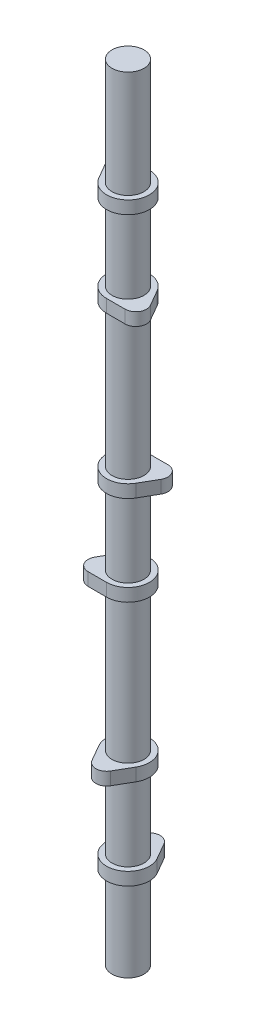
ISO-10303-21;
HEADER;
FILE_DESCRIPTION(('STEP AP214'),'2;1');
FILE_NAME('part.step','',(''),(''),'','','');
FILE_SCHEMA(('AUTOMOTIVE_DESIGN { 1 0 10303 214 1 1 1 1 }'));
ENDSEC;
DATA;
#1=APPLICATION_CONTEXT('core data for automotive mechanical design processes');
#2=APPLICATION_PROTOCOL_DEFINITION('international standard','automotive_design',2000,#1);
#3=PRODUCT_CONTEXT('',#1,'mechanical');
#4=PRODUCT('Part','Part','',(#3));
#5=PRODUCT_RELATED_PRODUCT_CATEGORY('part','',(#4));
#6=PRODUCT_DEFINITION_FORMATION('','',#4);
#7=PRODUCT_DEFINITION_CONTEXT('part definition',#1,'design');
#8=PRODUCT_DEFINITION('design','',#6,#7);
#9=PRODUCT_DEFINITION_SHAPE('','',#8);
#10=(LENGTH_UNIT() NAMED_UNIT(*) SI_UNIT(.MILLI.,.METRE.));
#11=(NAMED_UNIT(*) PLANE_ANGLE_UNIT() SI_UNIT($,.RADIAN.));
#12=(NAMED_UNIT(*) SI_UNIT($,.STERADIAN.) SOLID_ANGLE_UNIT());
#13=UNCERTAINTY_MEASURE_WITH_UNIT(LENGTH_MEASURE(1.E-05),#10,'distance_accuracy_value','');
#14=(GEOMETRIC_REPRESENTATION_CONTEXT(3) GLOBAL_UNCERTAINTY_ASSIGNED_CONTEXT((#13)) GLOBAL_UNIT_ASSIGNED_CONTEXT((#10,
#11,#12)) REPRESENTATION_CONTEXT('',''));
#15=CARTESIAN_POINT('',(0.,0.,0.));
#16=DIRECTION('',(0.,0.,1.));
#17=DIRECTION('',(1.,0.,0.));
#18=AXIS2_PLACEMENT_3D('',#15,#16,#17);
#19=CARTESIAN_POINT('',(0.,416.56,0.));
#20=DIRECTION('',(0.,-1.,0.));
#21=DIRECTION('',(0.,0.,-1.));
#22=AXIS2_PLACEMENT_3D('',#19,#20,#21);
#23=CYLINDRICAL_SURFACE('',#22,9.5);
#24=CARTESIAN_POINT('',(0.,299.72,0.));
#25=DIRECTION('',(0.,1.,0.));
#26=DIRECTION('',(0.,0.,1.));
#27=AXIS2_PLACEMENT_3D('',#24,#25,#26);
#28=CIRCLE('',#27,9.5);
#29=CARTESIAN_POINT('',(0.,299.72,9.5));
#30=VERTEX_POINT('',#29);
#31=EDGE_CURVE('E294',#30,#30,#28,.T.);
#32=ORIENTED_EDGE('',*,*,#31,.T.);
#33=EDGE_LOOP('',(#32));
#34=FACE_BOUND('',#33,.T.);
#35=CARTESIAN_POINT('',(0.,345.44,0.));
#36=DIRECTION('',(0.,1.,0.));
#37=DIRECTION('',(0.,0.,1.));
#38=AXIS2_PLACEMENT_3D('',#35,#36,#37);
#39=CIRCLE('',#38,9.5);
#40=CARTESIAN_POINT('',(0.,345.44,9.5));
#41=VERTEX_POINT('',#40);
#42=EDGE_CURVE('E11',#41,#41,#39,.T.);
#43=ORIENTED_EDGE('',*,*,#42,.F.);
#44=EDGE_LOOP('',(#43));
#45=FACE_BOUND('',#44,.T.);
#46=ADVANCED_FACE('F42',(#34,#45),#23,.T.);
#47=CARTESIAN_POINT('',(0.,207.01,0.));
#48=DIRECTION('',(0.,1.,0.));
#49=DIRECTION('',(0.,0.,1.));
#50=AXIS2_PLACEMENT_3D('',#47,#48,#49);
#51=CIRCLE('',#50,9.5);
#52=CARTESIAN_POINT('',(0.,207.01,9.5));
#53=VERTEX_POINT('',#52);
#54=EDGE_CURVE('E337',#53,#53,#51,.T.);
#55=ORIENTED_EDGE('',*,*,#54,.T.);
#56=EDGE_LOOP('',(#55));
#57=FACE_BOUND('',#56,.T.);
#58=CARTESIAN_POINT('',(0.,292.1,0.));
#59=DIRECTION('',(0.,1.,0.));
#60=DIRECTION('',(0.,0.,1.));
#61=AXIS2_PLACEMENT_3D('',#58,#59,#60);
#62=CIRCLE('',#61,9.5);
#63=CARTESIAN_POINT('',(0.,292.1,9.5));
#64=VERTEX_POINT('',#63);
#65=EDGE_CURVE('E53',#64,#64,#62,.T.);
#66=ORIENTED_EDGE('',*,*,#65,.F.);
#67=EDGE_LOOP('',(#66));
#68=FACE_BOUND('',#67,.T.);
#69=ADVANCED_FACE('F536',(#57,#68),#23,.T.);
#70=CARTESIAN_POINT('',(0.,153.67,0.));
#71=DIRECTION('',(0.,1.,0.));
#72=DIRECTION('',(0.,0.,1.));
#73=AXIS2_PLACEMENT_3D('',#70,#71,#72);
#74=CIRCLE('',#73,9.5);
#75=CARTESIAN_POINT('',(0.,153.67,9.5));
#76=VERTEX_POINT('',#75);
#77=EDGE_CURVE('E380',#76,#76,#74,.T.);
#78=ORIENTED_EDGE('',*,*,#77,.T.);
#79=EDGE_LOOP('',(#78));
#80=FACE_BOUND('',#79,.T.);
#81=CARTESIAN_POINT('',(0.,199.39,0.));
#82=DIRECTION('',(0.,1.,0.));
#83=DIRECTION('',(0.,0.,1.));
#84=AXIS2_PLACEMENT_3D('',#81,#82,#83);
#85=CIRCLE('',#84,9.5);
#86=CARTESIAN_POINT('',(0.,199.39,9.5));
#87=VERTEX_POINT('',#86);
#88=EDGE_CURVE('E484',#87,#87,#85,.T.);
#89=ORIENTED_EDGE('',*,*,#88,.F.);
#90=EDGE_LOOP('',(#89));
#91=FACE_BOUND('',#90,.T.);
#92=ADVANCED_FACE('F542',(#80,#91),#23,.T.);
#93=CARTESIAN_POINT('',(0.,60.96,0.));
#94=DIRECTION('',(0.,1.,0.));
#95=DIRECTION('',(0.,0.,1.));
#96=AXIS2_PLACEMENT_3D('',#93,#94,#95);
#97=CIRCLE('',#96,9.5);
#98=CARTESIAN_POINT('',(0.,60.96,9.5));
#99=VERTEX_POINT('',#98);
#100=EDGE_CURVE('E423',#99,#99,#97,.T.);
#101=ORIENTED_EDGE('',*,*,#100,.T.);
#102=EDGE_LOOP('',(#101));
#103=FACE_BOUND('',#102,.T.);
#104=CARTESIAN_POINT('',(0.,146.05,0.));
#105=DIRECTION('',(0.,1.,0.));
#106=DIRECTION('',(0.,0.,1.));
#107=AXIS2_PLACEMENT_3D('',#104,#105,#106);
#108=CIRCLE('',#107,9.5);
#109=CARTESIAN_POINT('',(0.,146.05,9.5));
#110=VERTEX_POINT('',#109);
#111=EDGE_CURVE('E477',#110,#110,#108,.T.);
#112=ORIENTED_EDGE('',*,*,#111,.F.);
#113=EDGE_LOOP('',(#112));
#114=FACE_BOUND('',#113,.T.);
#115=ADVANCED_FACE('F573',(#103,#114),#23,.T.);
#116=CARTESIAN_POINT('',(0.,7.62000000000002,0.));
#117=DIRECTION('',(0.,1.,0.));
#118=DIRECTION('',(0.,0.,1.));
#119=AXIS2_PLACEMENT_3D('',#116,#117,#118);
#120=CIRCLE('',#119,9.5);
#121=CARTESIAN_POINT('',(0.,7.62000000000002,9.5));
#122=VERTEX_POINT('',#121);
#123=EDGE_CURVE('E428',#122,#122,#120,.F.);
#124=ORIENTED_EDGE('',*,*,#123,.F.);
#125=EDGE_LOOP('',(#124));
#126=FACE_BOUND('',#125,.T.);
#127=CARTESIAN_POINT('',(0.,53.34,0.));
#128=DIRECTION('',(0.,1.,0.));
#129=DIRECTION('',(0.,0.,1.));
#130=AXIS2_PLACEMENT_3D('',#127,#128,#129);
#131=CIRCLE('',#130,9.5);
#132=CARTESIAN_POINT('',(0.,53.34,9.5));
#133=VERTEX_POINT('',#132);
#134=EDGE_CURVE('E473',#133,#133,#131,.T.);
#135=ORIENTED_EDGE('',*,*,#134,.F.);
#136=EDGE_LOOP('',(#135));
#137=FACE_BOUND('',#136,.T.);
#138=ADVANCED_FACE('F561',(#126,#137),#23,.T.);
#139=CARTESIAN_POINT('',(0.,7.62,-12.7));
#140=DIRECTION('',(0.,-1.,0.));
#141=DIRECTION('',(0.,0.,-1.));
#142=AXIS2_PLACEMENT_3D('',#139,#140,#141);
#143=CYLINDRICAL_SURFACE('',#142,6.35);
#144=CARTESIAN_POINT('',(0.,0.,-12.7));
#145=DIRECTION('',(0.,1.,0.));
#146=DIRECTION('',(0.,0.,1.));
#147=AXIS2_PLACEMENT_3D('',#144,#145,#146);
#148=CIRCLE('',#147,6.35);
#149=CARTESIAN_POINT('',(5.49926131403118,0.,-15.875));
#150=VERTEX_POINT('',#149);
#151=CARTESIAN_POINT('',(-5.49926131403118,0.,-15.875));
#152=VERTEX_POINT('',#151);
#153=EDGE_CURVE('E436',#150,#152,#148,.T.);
#154=ORIENTED_EDGE('',*,*,#153,.T.);
#155=DIRECTION('',(0.,-1.,0.));
#156=VECTOR('',#155,1.);
#157=CARTESIAN_POINT('',(-5.49926131403118,7.62,-15.875));
#158=LINE('',#157,#156);
#159=CARTESIAN_POINT('',(-5.49926131403118,7.62,-15.875));
#160=VERTEX_POINT('',#159);
#161=EDGE_CURVE('E466',#160,#152,#158,.T.);
#162=ORIENTED_EDGE('',*,*,#161,.F.);
#163=CARTESIAN_POINT('',(0.,7.62,-12.7));
#164=DIRECTION('',(0.,1.,0.));
#165=DIRECTION('',(0.,0.,1.));
#166=AXIS2_PLACEMENT_3D('',#163,#164,#165);
#167=CIRCLE('',#166,6.35);
#168=CARTESIAN_POINT('',(5.49926131403118,7.62,-15.875));
#169=VERTEX_POINT('',#168);
#170=EDGE_CURVE('E437',#169,#160,#167,.T.);
#171=ORIENTED_EDGE('',*,*,#170,.F.);
#172=DIRECTION('',(0.,-1.,0.));
#173=VECTOR('',#172,1.);
#174=CARTESIAN_POINT('',(5.49926131403118,7.62,-15.875));
#175=LINE('',#174,#173);
#176=EDGE_CURVE('E447',#169,#150,#175,.T.);
#177=ORIENTED_EDGE('',*,*,#176,.T.);
#178=EDGE_LOOP('',(#154,#162,#171,#177));
#179=FACE_BOUND('',#178,.T.);
#180=ADVANCED_FACE('F44',(#179),#143,.T.);
#181=CARTESIAN_POINT('',(-5.49926131403118,7.62,-15.875));
#182=DIRECTION('',(0.866025403784439,0.,0.5));
#183=DIRECTION('',(0.5,0.,-0.866025403784439));
#184=AXIS2_PLACEMENT_3D('',#181,#182,#183);
#185=PLANE('',#184);
#186=DIRECTION('',(-0.5,0.,0.866025403784439));
#187=VECTOR('',#186,1.);
#188=CARTESIAN_POINT('',(-5.49926131403118,0.,-15.875));
#189=LINE('',#188,#187);
#190=CARTESIAN_POINT('',(-10.9985226280624,0.,-6.35000000000001));
#191=VERTEX_POINT('',#190);
#192=EDGE_CURVE('E451',#152,#191,#189,.T.);
#193=ORIENTED_EDGE('',*,*,#192,.T.);
#194=DIRECTION('',(0.,-1.,0.));
#195=VECTOR('',#194,1.);
#196=CARTESIAN_POINT('',(-10.9985226280624,7.62,-6.35000000000001));
#197=LINE('',#196,#195);
#198=CARTESIAN_POINT('',(-10.9985226280624,7.62,-6.35000000000001));
#199=VERTEX_POINT('',#198);
#200=EDGE_CURVE('E463',#199,#191,#197,.T.);
#201=ORIENTED_EDGE('',*,*,#200,.F.);
#202=DIRECTION('',(-0.5,0.,0.866025403784439));
#203=VECTOR('',#202,1.);
#204=CARTESIAN_POINT('',(-5.49926131403118,7.62,-15.875));
#205=LINE('',#204,#203);
#206=EDGE_CURVE('E93',#160,#199,#205,.T.);
#207=ORIENTED_EDGE('',*,*,#206,.F.);
#208=ORIENTED_EDGE('',*,*,#161,.T.);
#209=EDGE_LOOP('',(#193,#201,#207,#208));
#210=FACE_BOUND('',#209,.T.);
#211=ADVANCED_FACE('F579',(#210),#185,.F.);
#212=CARTESIAN_POINT('',(0.,7.62,0.));
#213=DIRECTION('',(0.,-1.,0.));
#214=DIRECTION('',(0.,0.,-1.));
#215=AXIS2_PLACEMENT_3D('',#212,#213,#214);
#216=CYLINDRICAL_SURFACE('',#215,12.7);
#217=CARTESIAN_POINT('',(0.,0.,0.));
#218=DIRECTION('',(0.,1.,0.));
#219=DIRECTION('',(0.,0.,1.));
#220=AXIS2_PLACEMENT_3D('',#217,#218,#219);
#221=CIRCLE('',#220,12.7);
#222=CARTESIAN_POINT('',(10.9985226280624,0.,-6.35));
#223=VERTEX_POINT('',#222);
#224=EDGE_CURVE('E79',#191,#223,#221,.T.);
#225=ORIENTED_EDGE('',*,*,#224,.T.);
#226=DIRECTION('',(0.,-1.,0.));
#227=VECTOR('',#226,1.);
#228=CARTESIAN_POINT('',(10.9985226280624,7.62,-6.35));
#229=LINE('',#228,#227);
#230=CARTESIAN_POINT('',(10.9985226280624,7.62,-6.35));
#231=VERTEX_POINT('',#230);
#232=EDGE_CURVE('E460',#231,#223,#229,.T.);
#233=ORIENTED_EDGE('',*,*,#232,.F.);
#234=CARTESIAN_POINT('',(0.,7.62,0.));
#235=DIRECTION('',(0.,1.,0.));
#236=DIRECTION('',(0.,0.,1.));
#237=AXIS2_PLACEMENT_3D('',#234,#235,#236);
#238=CIRCLE('',#237,12.7);
#239=EDGE_CURVE('E442',#199,#231,#238,.T.);
#240=ORIENTED_EDGE('',*,*,#239,.F.);
#241=ORIENTED_EDGE('',*,*,#200,.T.);
#242=EDGE_LOOP('',(#225,#233,#240,#241));
#243=FACE_BOUND('',#242,.T.);
#244=ADVANCED_FACE('F1004',(#243),#216,.T.);
#245=CARTESIAN_POINT('',(5.49926131403118,7.62,-15.875));
#246=DIRECTION('',(-0.866025403784438,0.,0.5));
#247=DIRECTION('',(0.5,0.,0.866025403784439));
#248=AXIS2_PLACEMENT_3D('',#245,#246,#247);
#249=PLANE('',#248);
#250=DIRECTION('',(-0.5,0.,-0.866025403784439));
#251=VECTOR('',#250,1.);
#252=CARTESIAN_POINT('',(5.49926131403118,0.,-15.875));
#253=LINE('',#252,#251);
#254=EDGE_CURVE('E85',#223,#150,#253,.T.);
#255=ORIENTED_EDGE('',*,*,#254,.T.);
#256=ORIENTED_EDGE('',*,*,#176,.F.);
#257=DIRECTION('',(-0.5,0.,-0.866025403784439));
#258=VECTOR('',#257,1.);
#259=CARTESIAN_POINT('',(5.49926131403118,7.62,-15.875));
#260=LINE('',#259,#258);
#261=EDGE_CURVE('E61',#231,#169,#260,.T.);
#262=ORIENTED_EDGE('',*,*,#261,.F.);
#263=ORIENTED_EDGE('',*,*,#232,.T.);
#264=EDGE_LOOP('',(#255,#256,#262,#263));
#265=FACE_BOUND('',#264,.T.);
#266=ADVANCED_FACE('F995',(#265),#249,.F.);
#267=CARTESIAN_POINT('',(0.,7.62,-12.7));
#268=DIRECTION('',(0.,1.,0.));
#269=DIRECTION('',(0.,0.,1.));
#270=AXIS2_PLACEMENT_3D('',#267,#268,#269);
#271=PLANE('',#270);
#272=ORIENTED_EDGE('',*,*,#123,.T.);
#273=EDGE_LOOP('',(#272));
#274=FACE_BOUND('',#273,.T.);
#275=ORIENTED_EDGE('',*,*,#170,.T.);
#276=ORIENTED_EDGE('',*,*,#206,.T.);
#277=ORIENTED_EDGE('',*,*,#239,.T.);
#278=ORIENTED_EDGE('',*,*,#261,.T.);
#279=EDGE_LOOP('',(#275,#276,#277,#278));
#280=FACE_BOUND('',#279,.T.);
#281=ADVANCED_FACE('F985',(#274,#280),#271,.T.);
#282=CARTESIAN_POINT('',(0.,0.,-12.7));
#283=DIRECTION('',(0.,1.,0.));
#284=DIRECTION('',(0.,0.,1.));
#285=AXIS2_PLACEMENT_3D('',#282,#283,#284);
#286=PLANE('',#285);
#287=CARTESIAN_POINT('',(0.,0.,0.));
#288=DIRECTION('',(0.,1.,0.));
#289=DIRECTION('',(0.,0.,1.));
#290=AXIS2_PLACEMENT_3D('',#287,#288,#289);
#291=CIRCLE('',#290,9.5);
#292=CARTESIAN_POINT('',(0.,0.,9.5));
#293=VERTEX_POINT('',#292);
#294=EDGE_CURVE('E469',#293,#293,#291,.F.);
#295=ORIENTED_EDGE('',*,*,#294,.F.);
#296=EDGE_LOOP('',(#295));
#297=FACE_BOUND('',#296,.T.);
#298=ORIENTED_EDGE('',*,*,#153,.F.);
#299=ORIENTED_EDGE('',*,*,#254,.F.);
#300=ORIENTED_EDGE('',*,*,#224,.F.);
#301=ORIENTED_EDGE('',*,*,#192,.F.);
#302=EDGE_LOOP('',(#298,#299,#300,#301));
#303=FACE_BOUND('',#302,.T.);
#304=ADVANCED_FACE('F569',(#297,#303),#286,.F.);
#305=CARTESIAN_POINT('',(0.,-49.53,0.));
#306=DIRECTION('',(0.,1.,0.));
#307=DIRECTION('',(0.,0.,1.));
#308=AXIS2_PLACEMENT_3D('',#305,#306,#307);
#309=PLANE('',#308);
#310=CARTESIAN_POINT('',(0.,-49.53,0.));
#311=DIRECTION('',(0.,1.,0.));
#312=DIRECTION('',(0.,0.,1.));
#313=AXIS2_PLACEMENT_3D('',#310,#311,#312);
#314=CIRCLE('',#313,9.5);
#315=CARTESIAN_POINT('',(0.,-49.53,9.5));
#316=VERTEX_POINT('',#315);
#317=EDGE_CURVE('E429',#316,#316,#314,.T.);
#318=ORIENTED_EDGE('',*,*,#317,.F.);
#319=EDGE_LOOP('',(#318));
#320=FACE_BOUND('',#319,.T.);
#321=ADVANCED_FACE('F559',(#320),#309,.F.);
#322=ORIENTED_EDGE('',*,*,#317,.T.);
#323=EDGE_LOOP('',(#322));
#324=FACE_BOUND('',#323,.T.);
#325=ORIENTED_EDGE('',*,*,#294,.T.);
#326=EDGE_LOOP('',(#325));
#327=FACE_BOUND('',#326,.T.);
#328=ADVANCED_FACE('F549',(#324,#327),#23,.T.);
#329=CARTESIAN_POINT('',(0.,60.96,12.7));
#330=DIRECTION('',(0.,-1.,0.));
#331=DIRECTION('',(0.,0.,1.));
#332=AXIS2_PLACEMENT_3D('',#329,#330,#331);
#333=CYLINDRICAL_SURFACE('',#332,6.35);
#334=CARTESIAN_POINT('',(0.,53.34,12.7));
#335=DIRECTION('',(0.,1.,0.));
#336=DIRECTION('',(0.,0.,-1.));
#337=AXIS2_PLACEMENT_3D('',#334,#335,#336);
#338=CIRCLE('',#337,6.35);
#339=CARTESIAN_POINT('',(-5.49926131403129,53.34,15.875));
#340=VERTEX_POINT('',#339);
#341=CARTESIAN_POINT('',(5.49926131403107,53.34,15.875));
#342=VERTEX_POINT('',#341);
#343=EDGE_CURVE('E396',#340,#342,#338,.T.);
#344=ORIENTED_EDGE('',*,*,#343,.T.);
#345=DIRECTION('',(0.,-1.,0.));
#346=VECTOR('',#345,1.);
#347=CARTESIAN_POINT('',(5.49926131403107,60.96,15.875));
#348=LINE('',#347,#346);
#349=CARTESIAN_POINT('',(5.49926131403107,60.96,15.875));
#350=VERTEX_POINT('',#349);
#351=EDGE_CURVE('E419',#350,#342,#348,.T.);
#352=ORIENTED_EDGE('',*,*,#351,.F.);
#353=CARTESIAN_POINT('',(0.,60.96,12.7));
#354=DIRECTION('',(0.,1.,0.));
#355=DIRECTION('',(0.,0.,-1.));
#356=AXIS2_PLACEMENT_3D('',#353,#354,#355);
#357=CIRCLE('',#356,6.35);
#358=CARTESIAN_POINT('',(-5.49926131403129,60.96,15.875));
#359=VERTEX_POINT('',#358);
#360=EDGE_CURVE('E381',#359,#350,#357,.T.);
#361=ORIENTED_EDGE('',*,*,#360,.F.);
#362=DIRECTION('',(0.,-1.,0.));
#363=VECTOR('',#362,1.);
#364=CARTESIAN_POINT('',(-5.49926131403129,60.96,15.875));
#365=LINE('',#364,#363);
#366=EDGE_CURVE('E395',#359,#340,#365,.T.);
#367=ORIENTED_EDGE('',*,*,#366,.T.);
#368=EDGE_LOOP('',(#344,#352,#361,#367));
#369=FACE_BOUND('',#368,.T.);
#370=ADVANCED_FACE('F558',(#369),#333,.T.);
#371=CARTESIAN_POINT('',(5.49926131403107,60.96,15.875));
#372=DIRECTION('',(-0.866025403784435,0.,-0.500000000000006));
#373=DIRECTION('',(-0.500000000000006,0.,0.866025403784435));
#374=AXIS2_PLACEMENT_3D('',#371,#372,#373);
#375=PLANE('',#374);
#376=DIRECTION('',(0.500000000000006,0.,-0.866025403784435));
#377=VECTOR('',#376,1.);
#378=CARTESIAN_POINT('',(5.49926131403107,53.34,15.875));
#379=LINE('',#378,#377);
#380=CARTESIAN_POINT('',(10.9985226280623,53.34,6.35000000000008));
#381=VERTEX_POINT('',#380);
#382=EDGE_CURVE('E400',#342,#381,#379,.T.);
#383=ORIENTED_EDGE('',*,*,#382,.T.);
#384=DIRECTION('',(0.,-1.,0.));
#385=VECTOR('',#384,1.);
#386=CARTESIAN_POINT('',(10.9985226280623,60.96,6.35000000000008));
#387=LINE('',#386,#385);
#388=CARTESIAN_POINT('',(10.9985226280623,60.96,6.35000000000008));
#389=VERTEX_POINT('',#388);
#390=EDGE_CURVE('E415',#389,#381,#387,.T.);
#391=ORIENTED_EDGE('',*,*,#390,.F.);
#392=DIRECTION('',(0.500000000000006,0.,-0.866025403784435));
#393=VECTOR('',#392,1.);
#394=CARTESIAN_POINT('',(5.49926131403107,60.96,15.875));
#395=LINE('',#394,#393);
#396=EDGE_CURVE('E385',#350,#389,#395,.T.);
#397=ORIENTED_EDGE('',*,*,#396,.F.);
#398=ORIENTED_EDGE('',*,*,#351,.T.);
#399=EDGE_LOOP('',(#383,#391,#397,#398));
#400=FACE_BOUND('',#399,.T.);
#401=ADVANCED_FACE('F566',(#400),#375,.F.);
#402=CARTESIAN_POINT('',(0.,60.96,0.));
#403=DIRECTION('',(0.,-1.,0.));
#404=DIRECTION('',(0.,0.,1.));
#405=AXIS2_PLACEMENT_3D('',#402,#403,#404);
#406=CYLINDRICAL_SURFACE('',#405,12.7);
#407=CARTESIAN_POINT('',(0.,53.34,0.));
#408=DIRECTION('',(0.,1.,0.));
#409=DIRECTION('',(0.,0.,-1.));
#410=AXIS2_PLACEMENT_3D('',#407,#408,#409);
#411=CIRCLE('',#410,12.7);
#412=CARTESIAN_POINT('',(-10.9985226280624,53.34,6.34999999999992));
#413=VERTEX_POINT('',#412);
#414=EDGE_CURVE('E403',#381,#413,#411,.T.);
#415=ORIENTED_EDGE('',*,*,#414,.T.);
#416=DIRECTION('',(0.,-1.,0.));
#417=VECTOR('',#416,1.);
#418=CARTESIAN_POINT('',(-10.9985226280624,60.96,6.34999999999992));
#419=LINE('',#418,#417);
#420=CARTESIAN_POINT('',(-10.9985226280624,60.96,6.34999999999992));
#421=VERTEX_POINT('',#420);
#422=EDGE_CURVE('E411',#421,#413,#419,.T.);
#423=ORIENTED_EDGE('',*,*,#422,.F.);
#424=CARTESIAN_POINT('',(0.,60.96,0.));
#425=DIRECTION('',(0.,1.,0.));
#426=DIRECTION('',(0.,0.,-1.));
#427=AXIS2_PLACEMENT_3D('',#424,#425,#426);
#428=CIRCLE('',#427,12.7);
#429=EDGE_CURVE('E389',#389,#421,#428,.T.);
#430=ORIENTED_EDGE('',*,*,#429,.F.);
#431=ORIENTED_EDGE('',*,*,#390,.T.);
#432=EDGE_LOOP('',(#415,#423,#430,#431));
#433=FACE_BOUND('',#432,.T.);
#434=ADVANCED_FACE('F604',(#433),#406,.T.);
#435=CARTESIAN_POINT('',(-5.49926131403129,60.96,15.875));
#436=DIRECTION('',(0.866025403784442,0.,-0.499999999999994));
#437=DIRECTION('',(-0.499999999999994,0.,-0.866025403784442));
#438=AXIS2_PLACEMENT_3D('',#435,#436,#437);
#439=PLANE('',#438);
#440=DIRECTION('',(0.499999999999994,0.,0.866025403784442));
#441=VECTOR('',#440,1.);
#442=CARTESIAN_POINT('',(-5.49926131403129,53.34,15.875));
#443=LINE('',#442,#441);
#444=EDGE_CURVE('E386',#413,#340,#443,.T.);
#445=ORIENTED_EDGE('',*,*,#444,.T.);
#446=ORIENTED_EDGE('',*,*,#366,.F.);
#447=DIRECTION('',(0.499999999999994,0.,0.866025403784442));
#448=VECTOR('',#447,1.);
#449=CARTESIAN_POINT('',(-5.49926131403129,60.96,15.875));
#450=LINE('',#449,#448);
#451=EDGE_CURVE('E392',#421,#359,#450,.T.);
#452=ORIENTED_EDGE('',*,*,#451,.F.);
#453=ORIENTED_EDGE('',*,*,#422,.T.);
#454=EDGE_LOOP('',(#445,#446,#452,#453));
#455=FACE_BOUND('',#454,.T.);
#456=ADVANCED_FACE('F600',(#455),#439,.F.);
#457=CARTESIAN_POINT('',(0.,60.96,12.7));
#458=DIRECTION('',(0.,1.,0.));
#459=DIRECTION('',(0.,0.,-1.));
#460=AXIS2_PLACEMENT_3D('',#457,#458,#459);
#461=PLANE('',#460);
#462=ORIENTED_EDGE('',*,*,#100,.F.);
#463=EDGE_LOOP('',(#462));
#464=FACE_BOUND('',#463,.T.);
#465=ORIENTED_EDGE('',*,*,#360,.T.);
#466=ORIENTED_EDGE('',*,*,#396,.T.);
#467=ORIENTED_EDGE('',*,*,#429,.T.);
#468=ORIENTED_EDGE('',*,*,#451,.T.);
#469=EDGE_LOOP('',(#465,#466,#467,#468));
#470=FACE_BOUND('',#469,.T.);
#471=ADVANCED_FACE('F590',(#464,#470),#461,.T.);
#472=CARTESIAN_POINT('',(0.,53.34,12.7));
#473=DIRECTION('',(0.,1.,0.));
#474=DIRECTION('',(0.,0.,-1.));
#475=AXIS2_PLACEMENT_3D('',#472,#473,#474);
#476=PLANE('',#475);
#477=ORIENTED_EDGE('',*,*,#134,.T.);
#478=EDGE_LOOP('',(#477));
#479=FACE_BOUND('',#478,.T.);
#480=ORIENTED_EDGE('',*,*,#343,.F.);
#481=ORIENTED_EDGE('',*,*,#444,.F.);
#482=ORIENTED_EDGE('',*,*,#414,.F.);
#483=ORIENTED_EDGE('',*,*,#382,.F.);
#484=EDGE_LOOP('',(#480,#481,#482,#483));
#485=FACE_BOUND('',#484,.T.);
#486=ADVANCED_FACE('F586',(#479,#485),#476,.F.);
#487=CARTESIAN_POINT('',(-10.9985226280623,153.67,6.35000000000005));
#488=DIRECTION('',(0.,-1.,0.));
#489=DIRECTION('',(-0.866025403784436,0.,0.500000000000004));
#490=AXIS2_PLACEMENT_3D('',#487,#488,#489);
#491=CYLINDRICAL_SURFACE('',#490,6.35);
#492=CARTESIAN_POINT('',(-10.9985226280623,146.05,6.35000000000005));
#493=DIRECTION('',(0.,1.,0.));
#494=DIRECTION('',(0.866025403784436,0.,-0.500000000000004));
#495=AXIS2_PLACEMENT_3D('',#492,#493,#494);
#496=CIRCLE('',#495,6.35);
#497=CARTESIAN_POINT('',(-16.4977839420935,146.05,3.17500000000008));
#498=VERTEX_POINT('',#497);
#499=CARTESIAN_POINT('',(-10.9985226280623,146.05,12.7000000000001));
#500=VERTEX_POINT('',#499);
#501=EDGE_CURVE('E353',#498,#500,#496,.T.);
#502=ORIENTED_EDGE('',*,*,#501,.T.);
#503=DIRECTION('',(0.,-1.,0.));
#504=VECTOR('',#503,1.);
#505=CARTESIAN_POINT('',(-10.9985226280623,153.67,12.7000000000001));
#506=LINE('',#505,#504);
#507=CARTESIAN_POINT('',(-10.9985226280623,153.67,12.7000000000001));
#508=VERTEX_POINT('',#507);
#509=EDGE_CURVE('E376',#508,#500,#506,.T.);
#510=ORIENTED_EDGE('',*,*,#509,.F.);
#511=CARTESIAN_POINT('',(-10.9985226280623,153.67,6.35000000000005));
#512=DIRECTION('',(0.,1.,0.));
#513=DIRECTION('',(0.866025403784436,0.,-0.500000000000004));
#514=AXIS2_PLACEMENT_3D('',#511,#512,#513);
#515=CIRCLE('',#514,6.35);
#516=CARTESIAN_POINT('',(-16.4977839420935,153.67,3.17500000000008));
#517=VERTEX_POINT('',#516);
#518=EDGE_CURVE('E338',#517,#508,#515,.T.);
#519=ORIENTED_EDGE('',*,*,#518,.F.);
#520=DIRECTION('',(0.,-1.,0.));
#521=VECTOR('',#520,1.);
#522=CARTESIAN_POINT('',(-16.4977839420935,153.67,3.17500000000008));
#523=LINE('',#522,#521);
#524=EDGE_CURVE('E352',#517,#498,#523,.T.);
#525=ORIENTED_EDGE('',*,*,#524,.T.);
#526=EDGE_LOOP('',(#502,#510,#519,#525));
#527=FACE_BOUND('',#526,.T.);
#528=ADVANCED_FACE('F589',(#527),#491,.T.);
#529=CARTESIAN_POINT('',(-10.9985226280623,153.67,12.7000000000001));
#530=DIRECTION('',(0.,0.,-1.));
#531=DIRECTION('',(-1.,0.,0.));
#532=AXIS2_PLACEMENT_3D('',#529,#530,#531);
#533=PLANE('',#532);
#534=DIRECTION('',(1.,0.,0.));
#535=VECTOR('',#534,1.);
#536=CARTESIAN_POINT('',(-10.9985226280623,146.05,12.7000000000001));
#537=LINE('',#536,#535);
#538=CARTESIAN_POINT('',(0.,146.05,12.7));
#539=VERTEX_POINT('',#538);
#540=EDGE_CURVE('E357',#500,#539,#537,.T.);
#541=ORIENTED_EDGE('',*,*,#540,.T.);
#542=DIRECTION('',(0.,-1.,0.));
#543=VECTOR('',#542,1.);
#544=CARTESIAN_POINT('',(0.,153.67,12.7));
#545=LINE('',#544,#543);
#546=CARTESIAN_POINT('',(0.,153.67,12.7));
#547=VERTEX_POINT('',#546);
#548=EDGE_CURVE('E372',#547,#539,#545,.T.);
#549=ORIENTED_EDGE('',*,*,#548,.F.);
#550=DIRECTION('',(1.,0.,0.));
#551=VECTOR('',#550,1.);
#552=CARTESIAN_POINT('',(-10.9985226280623,153.67,12.7000000000001));
#553=LINE('',#552,#551);
#554=EDGE_CURVE('E342',#508,#547,#553,.T.);
#555=ORIENTED_EDGE('',*,*,#554,.F.);
#556=ORIENTED_EDGE('',*,*,#509,.T.);
#557=EDGE_LOOP('',(#541,#549,#555,#556));
#558=FACE_BOUND('',#557,.T.);
#559=ADVANCED_FACE('F656',(#558),#533,.F.);
#560=CARTESIAN_POINT('',(0.,153.67,0.));
#561=DIRECTION('',(0.,-1.,0.));
#562=DIRECTION('',(-0.866025403784436,0.,0.500000000000004));
#563=AXIS2_PLACEMENT_3D('',#560,#561,#562);
#564=CYLINDRICAL_SURFACE('',#563,12.7);
#565=CARTESIAN_POINT('',(0.,146.05,0.));
#566=DIRECTION('',(0.,1.,0.));
#567=DIRECTION('',(0.866025403784436,0.,-0.500000000000004));
#568=AXIS2_PLACEMENT_3D('',#565,#566,#567);
#569=CIRCLE('',#568,12.7);
#570=CARTESIAN_POINT('',(-10.9985226280624,146.05,-6.34999999999995));
#571=VERTEX_POINT('',#570);
#572=EDGE_CURVE('E360',#539,#571,#569,.T.);
#573=ORIENTED_EDGE('',*,*,#572,.T.);
#574=DIRECTION('',(0.,-1.,0.));
#575=VECTOR('',#574,1.);
#576=CARTESIAN_POINT('',(-10.9985226280624,153.67,-6.34999999999995));
#577=LINE('',#576,#575);
#578=CARTESIAN_POINT('',(-10.9985226280624,153.67,-6.34999999999995));
#579=VERTEX_POINT('',#578);
#580=EDGE_CURVE('E368',#579,#571,#577,.T.);
#581=ORIENTED_EDGE('',*,*,#580,.F.);
#582=CARTESIAN_POINT('',(0.,153.67,0.));
#583=DIRECTION('',(0.,1.,0.));
#584=DIRECTION('',(0.866025403784436,0.,-0.500000000000004));
#585=AXIS2_PLACEMENT_3D('',#582,#583,#584);
#586=CIRCLE('',#585,12.7);
#587=EDGE_CURVE('E346',#547,#579,#586,.T.);
#588=ORIENTED_EDGE('',*,*,#587,.F.);
#589=ORIENTED_EDGE('',*,*,#548,.T.);
#590=EDGE_LOOP('',(#573,#581,#588,#589));
#591=FACE_BOUND('',#590,.T.);
#592=ADVANCED_FACE('F666',(#591),#564,.T.);
#593=CARTESIAN_POINT('',(-16.4977839420935,153.67,3.17500000000008));
#594=DIRECTION('',(0.866025403784441,0.,0.499999999999996));
#595=DIRECTION('',(0.499999999999996,0.,-0.866025403784441));
#596=AXIS2_PLACEMENT_3D('',#593,#594,#595);
#597=PLANE('',#596);
#598=DIRECTION('',(-0.499999999999996,0.,0.866025403784441));
#599=VECTOR('',#598,1.);
#600=CARTESIAN_POINT('',(-16.4977839420935,146.05,3.17500000000008));
#601=LINE('',#600,#599);
#602=EDGE_CURVE('E343',#571,#498,#601,.T.);
#603=ORIENTED_EDGE('',*,*,#602,.T.);
#604=ORIENTED_EDGE('',*,*,#524,.F.);
#605=DIRECTION('',(-0.499999999999996,0.,0.866025403784441));
#606=VECTOR('',#605,1.);
#607=CARTESIAN_POINT('',(-16.4977839420935,153.67,3.17500000000008));
#608=LINE('',#607,#606);
#609=EDGE_CURVE('E349',#579,#517,#608,.T.);
#610=ORIENTED_EDGE('',*,*,#609,.F.);
#611=ORIENTED_EDGE('',*,*,#580,.T.);
#612=EDGE_LOOP('',(#603,#604,#610,#611));
#613=FACE_BOUND('',#612,.T.);
#614=ADVANCED_FACE('F676',(#613),#597,.F.);
#615=CARTESIAN_POINT('',(-10.9985226280623,153.67,6.35000000000005));
#616=DIRECTION('',(0.,1.,0.));
#617=DIRECTION('',(0.866025403784436,0.,-0.500000000000004));
#618=AXIS2_PLACEMENT_3D('',#615,#616,#617);
#619=PLANE('',#618);
#620=ORIENTED_EDGE('',*,*,#77,.F.);
#621=EDGE_LOOP('',(#620));
#622=FACE_BOUND('',#621,.T.);
#623=ORIENTED_EDGE('',*,*,#518,.T.);
#624=ORIENTED_EDGE('',*,*,#554,.T.);
#625=ORIENTED_EDGE('',*,*,#587,.T.);
#626=ORIENTED_EDGE('',*,*,#609,.T.);
#627=EDGE_LOOP('',(#623,#624,#625,#626));
#628=FACE_BOUND('',#627,.T.);
#629=ADVANCED_FACE('F687',(#622,#628),#619,.T.);
#630=CARTESIAN_POINT('',(-10.9985226280623,146.05,6.35000000000005));
#631=DIRECTION('',(0.,1.,0.));
#632=DIRECTION('',(0.866025403784436,0.,-0.500000000000004));
#633=AXIS2_PLACEMENT_3D('',#630,#631,#632);
#634=PLANE('',#633);
#635=ORIENTED_EDGE('',*,*,#111,.T.);
#636=EDGE_LOOP('',(#635));
#637=FACE_BOUND('',#636,.T.);
#638=ORIENTED_EDGE('',*,*,#501,.F.);
#639=ORIENTED_EDGE('',*,*,#602,.F.);
#640=ORIENTED_EDGE('',*,*,#572,.F.);
#641=ORIENTED_EDGE('',*,*,#540,.F.);
#642=EDGE_LOOP('',(#638,#639,#640,#641));
#643=FACE_BOUND('',#642,.T.);
#644=ADVANCED_FACE('F698',(#637,#643),#634,.F.);
#645=CARTESIAN_POINT('',(10.9985226280624,207.01,-6.34999999999997));
#646=DIRECTION('',(0.,-1.,0.));
#647=DIRECTION('',(0.86602540378444,0.,-0.499999999999998));
#648=AXIS2_PLACEMENT_3D('',#645,#646,#647);
#649=CYLINDRICAL_SURFACE('',#648,6.35);
#650=CARTESIAN_POINT('',(10.9985226280624,199.39,-6.34999999999997));
#651=DIRECTION('',(0.,1.,0.));
#652=DIRECTION('',(-0.86602540378444,0.,0.499999999999998));
#653=AXIS2_PLACEMENT_3D('',#650,#651,#652);
#654=CIRCLE('',#653,6.35);
#655=CARTESIAN_POINT('',(16.4977839420936,199.39,-3.17499999999996));
#656=VERTEX_POINT('',#655);
#657=CARTESIAN_POINT('',(10.9985226280624,199.39,-12.7));
#658=VERTEX_POINT('',#657);
#659=EDGE_CURVE('E310',#656,#658,#654,.T.);
#660=ORIENTED_EDGE('',*,*,#659,.T.);
#661=DIRECTION('',(0.,-1.,0.));
#662=VECTOR('',#661,1.);
#663=CARTESIAN_POINT('',(10.9985226280624,207.01,-12.7));
#664=LINE('',#663,#662);
#665=CARTESIAN_POINT('',(10.9985226280624,207.01,-12.7));
#666=VERTEX_POINT('',#665);
#667=EDGE_CURVE('E333',#666,#658,#664,.T.);
#668=ORIENTED_EDGE('',*,*,#667,.F.);
#669=CARTESIAN_POINT('',(10.9985226280624,207.01,-6.34999999999997));
#670=DIRECTION('',(0.,1.,0.));
#671=DIRECTION('',(-0.86602540378444,0.,0.499999999999998));
#672=AXIS2_PLACEMENT_3D('',#669,#670,#671);
#673=CIRCLE('',#672,6.35);
#674=CARTESIAN_POINT('',(16.4977839420936,207.01,-3.17499999999996));
#675=VERTEX_POINT('',#674);
#676=EDGE_CURVE('E295',#675,#666,#673,.T.);
#677=ORIENTED_EDGE('',*,*,#676,.F.);
#678=DIRECTION('',(0.,-1.,0.));
#679=VECTOR('',#678,1.);
#680=CARTESIAN_POINT('',(16.4977839420936,207.01,-3.17499999999996));
#681=LINE('',#680,#679);
#682=EDGE_CURVE('E309',#675,#656,#681,.T.);
#683=ORIENTED_EDGE('',*,*,#682,.T.);
#684=EDGE_LOOP('',(#660,#668,#677,#683));
#685=FACE_BOUND('',#684,.T.);
#686=ADVANCED_FACE('F709',(#685),#649,.T.);
#687=CARTESIAN_POINT('',(10.9985226280624,207.01,-12.7));
#688=DIRECTION('',(0.,0.,1.));
#689=DIRECTION('',(1.,0.,0.));
#690=AXIS2_PLACEMENT_3D('',#687,#688,#689);
#691=PLANE('',#690);
#692=DIRECTION('',(-1.,0.,0.));
#693=VECTOR('',#692,1.);
#694=CARTESIAN_POINT('',(10.9985226280624,199.39,-12.7));
#695=LINE('',#694,#693);
#696=CARTESIAN_POINT('',(0.,199.39,-12.7));
#697=VERTEX_POINT('',#696);
#698=EDGE_CURVE('E314',#658,#697,#695,.T.);
#699=ORIENTED_EDGE('',*,*,#698,.T.);
#700=DIRECTION('',(0.,-1.,0.));
#701=VECTOR('',#700,1.);
#702=CARTESIAN_POINT('',(0.,207.01,-12.7));
#703=LINE('',#702,#701);
#704=CARTESIAN_POINT('',(0.,207.01,-12.7));
#705=VERTEX_POINT('',#704);
#706=EDGE_CURVE('E329',#705,#697,#703,.T.);
#707=ORIENTED_EDGE('',*,*,#706,.F.);
#708=DIRECTION('',(-1.,0.,0.));
#709=VECTOR('',#708,1.);
#710=CARTESIAN_POINT('',(10.9985226280624,207.01,-12.7));
#711=LINE('',#710,#709);
#712=EDGE_CURVE('E299',#666,#705,#711,.T.);
#713=ORIENTED_EDGE('',*,*,#712,.F.);
#714=ORIENTED_EDGE('',*,*,#667,.T.);
#715=EDGE_LOOP('',(#699,#707,#713,#714));
#716=FACE_BOUND('',#715,.T.);
#717=ADVANCED_FACE('F720',(#716),#691,.F.);
#718=CARTESIAN_POINT('',(0.,207.01,0.));
#719=DIRECTION('',(0.,-1.,0.));
#720=DIRECTION('',(0.86602540378444,0.,-0.499999999999998));
#721=AXIS2_PLACEMENT_3D('',#718,#719,#720);
#722=CYLINDRICAL_SURFACE('',#721,12.7);
#723=CARTESIAN_POINT('',(0.,199.39,0.));
#724=DIRECTION('',(0.,1.,0.));
#725=DIRECTION('',(-0.86602540378444,0.,0.499999999999998));
#726=AXIS2_PLACEMENT_3D('',#723,#724,#725);
#727=CIRCLE('',#726,12.7);
#728=CARTESIAN_POINT('',(10.9985226280624,199.39,6.35000000000003));
#729=VERTEX_POINT('',#728);
#730=EDGE_CURVE('E317',#697,#729,#727,.T.);
#731=ORIENTED_EDGE('',*,*,#730,.T.);
#732=DIRECTION('',(0.,-1.,0.));
#733=VECTOR('',#732,1.);
#734=CARTESIAN_POINT('',(10.9985226280624,207.01,6.35000000000003));
#735=LINE('',#734,#733);
#736=CARTESIAN_POINT('',(10.9985226280624,207.01,6.35000000000003));
#737=VERTEX_POINT('',#736);
#738=EDGE_CURVE('E325',#737,#729,#735,.T.);
#739=ORIENTED_EDGE('',*,*,#738,.F.);
#740=CARTESIAN_POINT('',(0.,207.01,0.));
#741=DIRECTION('',(0.,1.,0.));
#742=DIRECTION('',(-0.86602540378444,0.,0.499999999999998));
#743=AXIS2_PLACEMENT_3D('',#740,#741,#742);
#744=CIRCLE('',#743,12.7);
#745=EDGE_CURVE('E303',#705,#737,#744,.T.);
#746=ORIENTED_EDGE('',*,*,#745,.F.);
#747=ORIENTED_EDGE('',*,*,#706,.T.);
#748=EDGE_LOOP('',(#731,#739,#746,#747));
#749=FACE_BOUND('',#748,.T.);
#750=ADVANCED_FACE('F731',(#749),#722,.T.);
#751=CARTESIAN_POINT('',(16.4977839420936,207.01,-3.17499999999996));
#752=DIRECTION('',(-0.866025403784437,0.,-0.500000000000002));
#753=DIRECTION('',(-0.500000000000002,0.,0.866025403784438));
#754=AXIS2_PLACEMENT_3D('',#751,#752,#753);
#755=PLANE('',#754);
#756=DIRECTION('',(0.500000000000002,0.,-0.866025403784438));
#757=VECTOR('',#756,1.);
#758=CARTESIAN_POINT('',(16.4977839420936,199.39,-3.17499999999996));
#759=LINE('',#758,#757);
#760=EDGE_CURVE('E300',#729,#656,#759,.T.);
#761=ORIENTED_EDGE('',*,*,#760,.T.);
#762=ORIENTED_EDGE('',*,*,#682,.F.);
#763=DIRECTION('',(0.500000000000002,0.,-0.866025403784438));
#764=VECTOR('',#763,1.);
#765=CARTESIAN_POINT('',(16.4977839420936,207.01,-3.17499999999996));
#766=LINE('',#765,#764);
#767=EDGE_CURVE('E306',#737,#675,#766,.T.);
#768=ORIENTED_EDGE('',*,*,#767,.F.);
#769=ORIENTED_EDGE('',*,*,#738,.T.);
#770=EDGE_LOOP('',(#761,#762,#768,#769));
#771=FACE_BOUND('',#770,.T.);
#772=ADVANCED_FACE('F742',(#771),#755,.F.);
#773=CARTESIAN_POINT('',(10.9985226280624,207.01,-6.34999999999997));
#774=DIRECTION('',(0.,1.,0.));
#775=DIRECTION('',(-0.86602540378444,0.,0.499999999999998));
#776=AXIS2_PLACEMENT_3D('',#773,#774,#775);
#777=PLANE('',#776);
#778=ORIENTED_EDGE('',*,*,#54,.F.);
#779=EDGE_LOOP('',(#778));
#780=FACE_BOUND('',#779,.T.);
#781=ORIENTED_EDGE('',*,*,#676,.T.);
#782=ORIENTED_EDGE('',*,*,#712,.T.);
#783=ORIENTED_EDGE('',*,*,#745,.T.);
#784=ORIENTED_EDGE('',*,*,#767,.T.);
#785=EDGE_LOOP('',(#781,#782,#783,#784));
#786=FACE_BOUND('',#785,.T.);
#787=ADVANCED_FACE('F753',(#780,#786),#777,.T.);
#788=CARTESIAN_POINT('',(10.9985226280624,199.39,-6.34999999999997));
#789=DIRECTION('',(0.,1.,0.));
#790=DIRECTION('',(-0.86602540378444,0.,0.499999999999998));
#791=AXIS2_PLACEMENT_3D('',#788,#789,#790);
#792=PLANE('',#791);
#793=ORIENTED_EDGE('',*,*,#88,.T.);
#794=EDGE_LOOP('',(#793));
#795=FACE_BOUND('',#794,.T.);
#796=ORIENTED_EDGE('',*,*,#659,.F.);
#797=ORIENTED_EDGE('',*,*,#760,.F.);
#798=ORIENTED_EDGE('',*,*,#730,.F.);
#799=ORIENTED_EDGE('',*,*,#698,.F.);
#800=EDGE_LOOP('',(#796,#797,#798,#799));
#801=FACE_BOUND('',#800,.T.);
#802=ADVANCED_FACE('F764',(#795,#801),#792,.F.);
#803=CARTESIAN_POINT('',(10.9985226280624,299.72,6.3499999999999));
#804=DIRECTION('',(0.,-1.,0.));
#805=DIRECTION('',(0.866025403784443,0.,0.499999999999992));
#806=AXIS2_PLACEMENT_3D('',#803,#804,#805);
#807=CYLINDRICAL_SURFACE('',#806,6.35);
#808=CARTESIAN_POINT('',(10.9985226280624,292.1,6.3499999999999));
#809=DIRECTION('',(0.,1.,0.));
#810=DIRECTION('',(-0.866025403784443,0.,-0.499999999999992));
#811=AXIS2_PLACEMENT_3D('',#808,#809,#810);
#812=CIRCLE('',#811,6.35);
#813=CARTESIAN_POINT('',(10.9985226280625,292.1,12.6999999999999));
#814=VERTEX_POINT('',#813);
#815=CARTESIAN_POINT('',(16.4977839420936,292.1,3.17499999999985));
#816=VERTEX_POINT('',#815);
#817=EDGE_CURVE('E248',#814,#816,#812,.T.);
#818=ORIENTED_EDGE('',*,*,#817,.T.);
#819=DIRECTION('',(0.,-1.,0.));
#820=VECTOR('',#819,1.);
#821=CARTESIAN_POINT('',(16.4977839420936,299.72,3.17499999999985));
#822=LINE('',#821,#820);
#823=CARTESIAN_POINT('',(16.4977839420936,299.72,3.17499999999985));
#824=VERTEX_POINT('',#823);
#825=EDGE_CURVE('E290',#824,#816,#822,.T.);
#826=ORIENTED_EDGE('',*,*,#825,.F.);
#827=CARTESIAN_POINT('',(10.9985226280624,299.72,6.3499999999999));
#828=DIRECTION('',(0.,1.,0.));
#829=DIRECTION('',(-0.866025403784443,0.,-0.499999999999992));
#830=AXIS2_PLACEMENT_3D('',#827,#828,#829);
#831=CIRCLE('',#830,6.35);
#832=CARTESIAN_POINT('',(10.9985226280625,299.72,12.6999999999999));
#833=VERTEX_POINT('',#832);
#834=EDGE_CURVE('E253',#833,#824,#831,.T.);
#835=ORIENTED_EDGE('',*,*,#834,.F.);
#836=DIRECTION('',(0.,-1.,0.));
#837=VECTOR('',#836,1.);
#838=CARTESIAN_POINT('',(10.9985226280625,299.72,12.6999999999999));
#839=LINE('',#838,#837);
#840=EDGE_CURVE('E267',#833,#814,#839,.T.);
#841=ORIENTED_EDGE('',*,*,#840,.T.);
#842=EDGE_LOOP('',(#818,#826,#835,#841));
#843=FACE_BOUND('',#842,.T.);
#844=ADVANCED_FACE('F515',(#843),#807,.T.);
#845=CARTESIAN_POINT('',(16.4977839420936,299.72,3.17499999999985));
#846=DIRECTION('',(-0.866025403784434,0.,0.500000000000008));
#847=DIRECTION('',(0.500000000000008,0.,0.866025403784434));
#848=AXIS2_PLACEMENT_3D('',#845,#846,#847);
#849=PLANE('',#848);
#850=DIRECTION('',(-0.500000000000008,0.,-0.866025403784434));
#851=VECTOR('',#850,1.);
#852=CARTESIAN_POINT('',(16.4977839420936,292.1,3.17499999999985));
#853=LINE('',#852,#851);
#854=CARTESIAN_POINT('',(10.9985226280623,292.1,-6.3500000000001));
#855=VERTEX_POINT('',#854);
#856=EDGE_CURVE('E271',#816,#855,#853,.T.);
#857=ORIENTED_EDGE('',*,*,#856,.T.);
#858=DIRECTION('',(0.,-1.,0.));
#859=VECTOR('',#858,1.);
#860=CARTESIAN_POINT('',(10.9985226280623,299.72,-6.3500000000001));
#861=LINE('',#860,#859);
#862=CARTESIAN_POINT('',(10.9985226280623,299.72,-6.3500000000001));
#863=VERTEX_POINT('',#862);
#864=EDGE_CURVE('E286',#863,#855,#861,.T.);
#865=ORIENTED_EDGE('',*,*,#864,.F.);
#866=DIRECTION('',(-0.500000000000008,0.,-0.866025403784434));
#867=VECTOR('',#866,1.);
#868=CARTESIAN_POINT('',(16.4977839420936,299.72,3.17499999999985));
#869=LINE('',#868,#867);
#870=EDGE_CURVE('E257',#824,#863,#869,.T.);
#871=ORIENTED_EDGE('',*,*,#870,.F.);
#872=ORIENTED_EDGE('',*,*,#825,.T.);
#873=EDGE_LOOP('',(#857,#865,#871,#872));
#874=FACE_BOUND('',#873,.T.);
#875=ADVANCED_FACE('F518',(#874),#849,.F.);
#876=CARTESIAN_POINT('',(0.,299.72,0.));
#877=DIRECTION('',(0.,-1.,0.));
#878=DIRECTION('',(0.866025403784443,0.,0.499999999999992));
#879=AXIS2_PLACEMENT_3D('',#876,#877,#878);
#880=CYLINDRICAL_SURFACE('',#879,12.7);
#881=CARTESIAN_POINT('',(0.,292.1,0.));
#882=DIRECTION('',(0.,1.,0.));
#883=DIRECTION('',(-0.866025403784443,0.,-0.499999999999992));
#884=AXIS2_PLACEMENT_3D('',#881,#882,#883);
#885=CIRCLE('',#884,12.7);
#886=CARTESIAN_POINT('',(1.17961196366423E-13,292.1,12.7));
#887=VERTEX_POINT('',#886);
#888=EDGE_CURVE('E274',#855,#887,#885,.T.);
#889=ORIENTED_EDGE('',*,*,#888,.T.);
#890=DIRECTION('',(0.,-1.,0.));
#891=VECTOR('',#890,1.);
#892=CARTESIAN_POINT('',(1.17961196366423E-13,299.72,12.7));
#893=LINE('',#892,#891);
#894=CARTESIAN_POINT('',(1.17961196366423E-13,299.72,12.7));
#895=VERTEX_POINT('',#894);
#896=EDGE_CURVE('E282',#895,#887,#893,.T.);
#897=ORIENTED_EDGE('',*,*,#896,.F.);
#898=CARTESIAN_POINT('',(0.,299.72,0.));
#899=DIRECTION('',(0.,1.,0.));
#900=DIRECTION('',(-0.866025403784443,0.,-0.499999999999992));
#901=AXIS2_PLACEMENT_3D('',#898,#899,#900);
#902=CIRCLE('',#901,12.7);
#903=EDGE_CURVE('E261',#863,#895,#902,.T.);
#904=ORIENTED_EDGE('',*,*,#903,.F.);
#905=ORIENTED_EDGE('',*,*,#864,.T.);
#906=EDGE_LOOP('',(#889,#897,#904,#905));
#907=FACE_BOUND('',#906,.T.);
#908=ADVANCED_FACE('F523',(#907),#880,.T.);
#909=CARTESIAN_POINT('',(10.9985226280625,299.72,12.6999999999999));
#910=DIRECTION('',(0.,0.,-1.));
#911=DIRECTION('',(-1.,0.,0.));
#912=AXIS2_PLACEMENT_3D('',#909,#910,#911);
#913=PLANE('',#912);
#914=DIRECTION('',(1.,0.,0.));
#915=VECTOR('',#914,1.);
#916=CARTESIAN_POINT('',(10.9985226280625,292.1,12.6999999999999));
#917=LINE('',#916,#915);
#918=EDGE_CURVE('E258',#887,#814,#917,.T.);
#919=ORIENTED_EDGE('',*,*,#918,.T.);
#920=ORIENTED_EDGE('',*,*,#840,.F.);
#921=DIRECTION('',(1.,0.,0.));
#922=VECTOR('',#921,1.);
#923=CARTESIAN_POINT('',(10.9985226280625,299.72,12.6999999999999));
#924=LINE('',#923,#922);
#925=EDGE_CURVE('E264',#895,#833,#924,.T.);
#926=ORIENTED_EDGE('',*,*,#925,.F.);
#927=ORIENTED_EDGE('',*,*,#896,.T.);
#928=EDGE_LOOP('',(#919,#920,#926,#927));
#929=FACE_BOUND('',#928,.T.);
#930=ADVANCED_FACE('F507',(#929),#913,.F.);
#931=CARTESIAN_POINT('',(10.9985226280624,299.72,6.3499999999999));
#932=DIRECTION('',(0.,1.,0.));
#933=DIRECTION('',(-0.866025403784443,0.,-0.499999999999992));
#934=AXIS2_PLACEMENT_3D('',#931,#932,#933);
#935=PLANE('',#934);
#936=ORIENTED_EDGE('',*,*,#31,.F.);
#937=EDGE_LOOP('',(#936));
#938=FACE_BOUND('',#937,.T.);
#939=ORIENTED_EDGE('',*,*,#834,.T.);
#940=ORIENTED_EDGE('',*,*,#870,.T.);
#941=ORIENTED_EDGE('',*,*,#903,.T.);
#942=ORIENTED_EDGE('',*,*,#925,.T.);
#943=EDGE_LOOP('',(#939,#940,#941,#942));
#944=FACE_BOUND('',#943,.T.);
#945=ADVANCED_FACE('F503',(#938,#944),#935,.T.);
#946=CARTESIAN_POINT('',(10.9985226280624,292.1,6.3499999999999));
#947=DIRECTION('',(0.,1.,0.));
#948=DIRECTION('',(-0.866025403784443,0.,-0.499999999999992));
#949=AXIS2_PLACEMENT_3D('',#946,#947,#948);
#950=PLANE('',#949);
#951=ORIENTED_EDGE('',*,*,#65,.T.);
#952=EDGE_LOOP('',(#951));
#953=FACE_BOUND('',#952,.T.);
#954=ORIENTED_EDGE('',*,*,#817,.F.);
#955=ORIENTED_EDGE('',*,*,#918,.F.);
#956=ORIENTED_EDGE('',*,*,#888,.F.);
#957=ORIENTED_EDGE('',*,*,#856,.F.);
#958=EDGE_LOOP('',(#954,#955,#956,#957));
#959=FACE_BOUND('',#958,.T.);
#960=ADVANCED_FACE('F506',(#953,#959),#950,.F.);
#961=CARTESIAN_POINT('',(-10.9985226280624,353.06,-6.34999999999997));
#962=DIRECTION('',(0.,-1.,0.));
#963=DIRECTION('',(-0.86602540378444,0.,-0.499999999999998));
#964=AXIS2_PLACEMENT_3D('',#961,#962,#963);
#965=CYLINDRICAL_SURFACE('',#964,6.35);
#966=CARTESIAN_POINT('',(-10.9985226280624,345.44,-6.34999999999997));
#967=DIRECTION('',(0.,1.,0.));
#968=DIRECTION('',(0.86602540378444,0.,0.499999999999998));
#969=AXIS2_PLACEMENT_3D('',#966,#967,#968);
#970=CIRCLE('',#969,6.35);
#971=CARTESIAN_POINT('',(-10.9985226280624,345.44,-12.7));
#972=VERTEX_POINT('',#971);
#973=CARTESIAN_POINT('',(-16.4977839420936,345.44,-3.17499999999996));
#974=VERTEX_POINT('',#973);
#975=EDGE_CURVE('E242',#972,#974,#970,.T.);
#976=ORIENTED_EDGE('',*,*,#975,.T.);
#977=DIRECTION('',(0.,-1.,0.));
#978=VECTOR('',#977,1.);
#979=CARTESIAN_POINT('',(-16.4977839420936,353.06,-3.17499999999996));
#980=LINE('',#979,#978);
#981=CARTESIAN_POINT('',(-16.4977839420936,353.06,-3.17499999999996));
#982=VERTEX_POINT('',#981);
#983=EDGE_CURVE('E220',#982,#974,#980,.T.);
#984=ORIENTED_EDGE('',*,*,#983,.F.);
#985=CARTESIAN_POINT('',(-10.9985226280624,353.06,-6.34999999999997));
#986=DIRECTION('',(0.,1.,0.));
#987=DIRECTION('',(0.86602540378444,0.,0.499999999999998));
#988=AXIS2_PLACEMENT_3D('',#985,#986,#987);
#989=CIRCLE('',#988,6.35);
#990=CARTESIAN_POINT('',(-10.9985226280624,353.06,-12.7));
#991=VERTEX_POINT('',#990);
#992=EDGE_CURVE('E228',#991,#982,#989,.T.);
#993=ORIENTED_EDGE('',*,*,#992,.F.);
#994=DIRECTION('',(0.,-1.,0.));
#995=VECTOR('',#994,1.);
#996=CARTESIAN_POINT('',(-10.9985226280624,353.06,-12.7));
#997=LINE('',#996,#995);
#998=EDGE_CURVE('E1103',#991,#972,#997,.T.);
#999=ORIENTED_EDGE('',*,*,#998,.T.);
#1000=EDGE_LOOP('',(#976,#984,#993,#999));
#1001=FACE_BOUND('',#1000,.T.);
#1002=ADVANCED_FACE('F240',(#1001),#965,.T.);
#1003=CARTESIAN_POINT('',(-16.4977839420936,353.06,-3.17499999999996));
#1004=DIRECTION('',(0.866025403784437,0.,-0.500000000000002));
#1005=DIRECTION('',(-0.500000000000002,0.,-0.866025403784437));
#1006=AXIS2_PLACEMENT_3D('',#1003,#1004,#1005);
#1007=PLANE('',#1006);
#1008=DIRECTION('',(0.500000000000002,0.,0.866025403784437));
#1009=VECTOR('',#1008,1.);
#1010=CARTESIAN_POINT('',(-16.4977839420936,345.44,-3.17499999999996));
#1011=LINE('',#1010,#1009);
#1012=CARTESIAN_POINT('',(-10.9985226280624,345.44,6.35000000000002));
#1013=VERTEX_POINT('',#1012);
#1014=EDGE_CURVE('E1090',#974,#1013,#1011,.T.);
#1015=ORIENTED_EDGE('',*,*,#1014,.T.);
#1016=DIRECTION('',(0.,-1.,0.));
#1017=VECTOR('',#1016,1.);
#1018=CARTESIAN_POINT('',(-10.9985226280624,353.06,6.35000000000002));
#1019=LINE('',#1018,#1017);
#1020=CARTESIAN_POINT('',(-10.9985226280624,353.06,6.35000000000002));
#1021=VERTEX_POINT('',#1020);
#1022=EDGE_CURVE('E223',#1021,#1013,#1019,.T.);
#1023=ORIENTED_EDGE('',*,*,#1022,.F.);
#1024=DIRECTION('',(0.500000000000002,0.,0.866025403784437));
#1025=VECTOR('',#1024,1.);
#1026=CARTESIAN_POINT('',(-16.4977839420936,353.06,-3.17499999999996));
#1027=LINE('',#1026,#1025);
#1028=EDGE_CURVE('E216',#982,#1021,#1027,.T.);
#1029=ORIENTED_EDGE('',*,*,#1028,.F.);
#1030=ORIENTED_EDGE('',*,*,#983,.T.);
#1031=EDGE_LOOP('',(#1015,#1023,#1029,#1030));
#1032=FACE_BOUND('',#1031,.T.);
#1033=ADVANCED_FACE('F218',(#1032),#1007,.F.);
#1034=CARTESIAN_POINT('',(0.,353.06,0.));
#1035=DIRECTION('',(0.,-1.,0.));
#1036=DIRECTION('',(-0.86602540378444,0.,-0.499999999999998));
#1037=AXIS2_PLACEMENT_3D('',#1034,#1035,#1036);
#1038=CYLINDRICAL_SURFACE('',#1037,12.7);
#1039=CARTESIAN_POINT('',(0.,345.44,0.));
#1040=DIRECTION('',(0.,1.,0.));
#1041=DIRECTION('',(0.86602540378444,0.,0.499999999999998));
#1042=AXIS2_PLACEMENT_3D('',#1039,#1040,#1041);
#1043=CIRCLE('',#1042,12.7);
#1044=CARTESIAN_POINT('',(0.,345.44,-12.7));
#1045=VERTEX_POINT('',#1044);
#1046=EDGE_CURVE('E1094',#1013,#1045,#1043,.T.);
#1047=ORIENTED_EDGE('',*,*,#1046,.T.);
#1048=DIRECTION('',(0.,-1.,0.));
#1049=VECTOR('',#1048,1.);
#1050=CARTESIAN_POINT('',(0.,353.06,-12.7));
#1051=LINE('',#1050,#1049);
#1052=CARTESIAN_POINT('',(0.,353.06,-12.7));
#1053=VERTEX_POINT('',#1052);
#1054=EDGE_CURVE('E249',#1053,#1045,#1051,.T.);
#1055=ORIENTED_EDGE('',*,*,#1054,.F.);
#1056=CARTESIAN_POINT('',(0.,353.06,0.));
#1057=DIRECTION('',(0.,1.,0.));
#1058=DIRECTION('',(0.86602540378444,0.,0.499999999999998));
#1059=AXIS2_PLACEMENT_3D('',#1056,#1057,#1058);
#1060=CIRCLE('',#1059,12.7);
#1061=EDGE_CURVE('E227',#1021,#1053,#1060,.T.);
#1062=ORIENTED_EDGE('',*,*,#1061,.F.);
#1063=ORIENTED_EDGE('',*,*,#1022,.T.);
#1064=EDGE_LOOP('',(#1047,#1055,#1062,#1063));
#1065=FACE_BOUND('',#1064,.T.);
#1066=ADVANCED_FACE('F839',(#1065),#1038,.T.);
#1067=CARTESIAN_POINT('',(-10.9985226280624,353.06,-12.7));
#1068=DIRECTION('',(0.,0.,1.));
#1069=DIRECTION('',(1.,0.,0.));
#1070=AXIS2_PLACEMENT_3D('',#1067,#1068,#1069);
#1071=PLANE('',#1070);
#1072=DIRECTION('',(-1.,0.,0.));
#1073=VECTOR('',#1072,1.);
#1074=CARTESIAN_POINT('',(-10.9985226280624,345.44,-12.7));
#1075=LINE('',#1074,#1073);
#1076=EDGE_CURVE('E238',#1045,#972,#1075,.T.);
#1077=ORIENTED_EDGE('',*,*,#1076,.T.);
#1078=ORIENTED_EDGE('',*,*,#998,.F.);
#1079=DIRECTION('',(-1.,0.,0.));
#1080=VECTOR('',#1079,1.);
#1081=CARTESIAN_POINT('',(-10.9985226280624,353.06,-12.7));
#1082=LINE('',#1081,#1080);
#1083=EDGE_CURVE('E233',#1053,#991,#1082,.T.);
#1084=ORIENTED_EDGE('',*,*,#1083,.F.);
#1085=ORIENTED_EDGE('',*,*,#1054,.T.);
#1086=EDGE_LOOP('',(#1077,#1078,#1084,#1085));
#1087=FACE_BOUND('',#1086,.T.);
#1088=ADVANCED_FACE('F849',(#1087),#1071,.F.);
#1089=CARTESIAN_POINT('',(-10.9985226280624,353.06,-6.34999999999997));
#1090=DIRECTION('',(0.,1.,0.));
#1091=DIRECTION('',(0.86602540378444,0.,0.499999999999998));
#1092=AXIS2_PLACEMENT_3D('',#1089,#1090,#1091);
#1093=PLANE('',#1092);
#1094=CARTESIAN_POINT('',(0.,353.06,0.));
#1095=DIRECTION('',(0.,1.,0.));
#1096=DIRECTION('',(0.,0.,1.));
#1097=AXIS2_PLACEMENT_3D('',#1094,#1095,#1096);
#1098=CIRCLE('',#1097,9.5);
#1099=CARTESIAN_POINT('',(0.,353.06,9.5));
#1100=VERTEX_POINT('',#1099);
#1101=EDGE_CURVE('E46',#1100,#1100,#1098,.T.);
#1102=ORIENTED_EDGE('',*,*,#1101,.F.);
#1103=EDGE_LOOP('',(#1102));
#1104=FACE_BOUND('',#1103,.T.);
#1105=ORIENTED_EDGE('',*,*,#992,.T.);
#1106=ORIENTED_EDGE('',*,*,#1028,.T.);
#1107=ORIENTED_EDGE('',*,*,#1061,.T.);
#1108=ORIENTED_EDGE('',*,*,#1083,.T.);
#1109=EDGE_LOOP('',(#1105,#1106,#1107,#1108));
#1110=FACE_BOUND('',#1109,.T.);
#1111=ADVANCED_FACE('F231',(#1104,#1110),#1093,.T.);
#1112=CARTESIAN_POINT('',(-10.9985226280624,345.44,-6.34999999999997));
#1113=DIRECTION('',(0.,1.,0.));
#1114=DIRECTION('',(0.86602540378444,0.,0.499999999999998));
#1115=AXIS2_PLACEMENT_3D('',#1112,#1113,#1114);
#1116=PLANE('',#1115);
#1117=ORIENTED_EDGE('',*,*,#42,.T.);
#1118=EDGE_LOOP('',(#1117));
#1119=FACE_BOUND('',#1118,.T.);
#1120=ORIENTED_EDGE('',*,*,#975,.F.);
#1121=ORIENTED_EDGE('',*,*,#1076,.F.);
#1122=ORIENTED_EDGE('',*,*,#1046,.F.);
#1123=ORIENTED_EDGE('',*,*,#1014,.F.);
#1124=EDGE_LOOP('',(#1120,#1121,#1122,#1123));
#1125=FACE_BOUND('',#1124,.T.);
#1126=ADVANCED_FACE('F553',(#1119,#1125),#1116,.F.);
#1127=CARTESIAN_POINT('',(0.,416.56,0.));
#1128=DIRECTION('',(0.,1.,0.));
#1129=DIRECTION('',(0.,0.,1.));
#1130=AXIS2_PLACEMENT_3D('',#1127,#1128,#1129);
#1131=PLANE('',#1130);
#1132=CARTESIAN_POINT('',(0.,416.56,0.));
#1133=DIRECTION('',(0.,1.,0.));
#1134=DIRECTION('',(0.,0.,1.));
#1135=AXIS2_PLACEMENT_3D('',#1132,#1133,#1134);
#1136=CIRCLE('',#1135,9.5);
#1137=CARTESIAN_POINT('',(0.,416.56,9.5));
#1138=VERTEX_POINT('',#1137);
#1139=EDGE_CURVE('E424',#1138,#1138,#1136,.T.);
#1140=ORIENTED_EDGE('',*,*,#1139,.T.);
#1141=EDGE_LOOP('',(#1140));
#1142=FACE_BOUND('',#1141,.T.);
#1143=ADVANCED_FACE('F547',(#1142),#1131,.T.);
#1144=ORIENTED_EDGE('',*,*,#1101,.T.);
#1145=EDGE_LOOP('',(#1144));
#1146=FACE_BOUND('',#1145,.T.);
#1147=ORIENTED_EDGE('',*,*,#1139,.F.);
#1148=EDGE_LOOP('',(#1147));
#1149=FACE_BOUND('',#1148,.T.);
#1150=ADVANCED_FACE('F538',(#1146,#1149),#23,.T.);
#1151=CLOSED_SHELL('',(#46,#69,#92,#115,#138,#180,#211,#244,#266,#281,#304,#321,#328,#370,#401,
#434,#456,#471,#486,#528,#559,#592,#614,#629,#644,#686,#717,#750,#772,#787,#802,#844,#875,#908,
#930,#945,#960,#1002,#1033,#1066,#1088,#1111,#1126,#1143,#1150));
#1152=MANIFOLD_SOLID_BREP('B2',#1151);
#1153=ADVANCED_BREP_SHAPE_REPRESENTATION('',(#18,#1152),#14);
#1154=SHAPE_DEFINITION_REPRESENTATION(#9,#1153);
ENDSEC;
END-ISO-10303-21;
